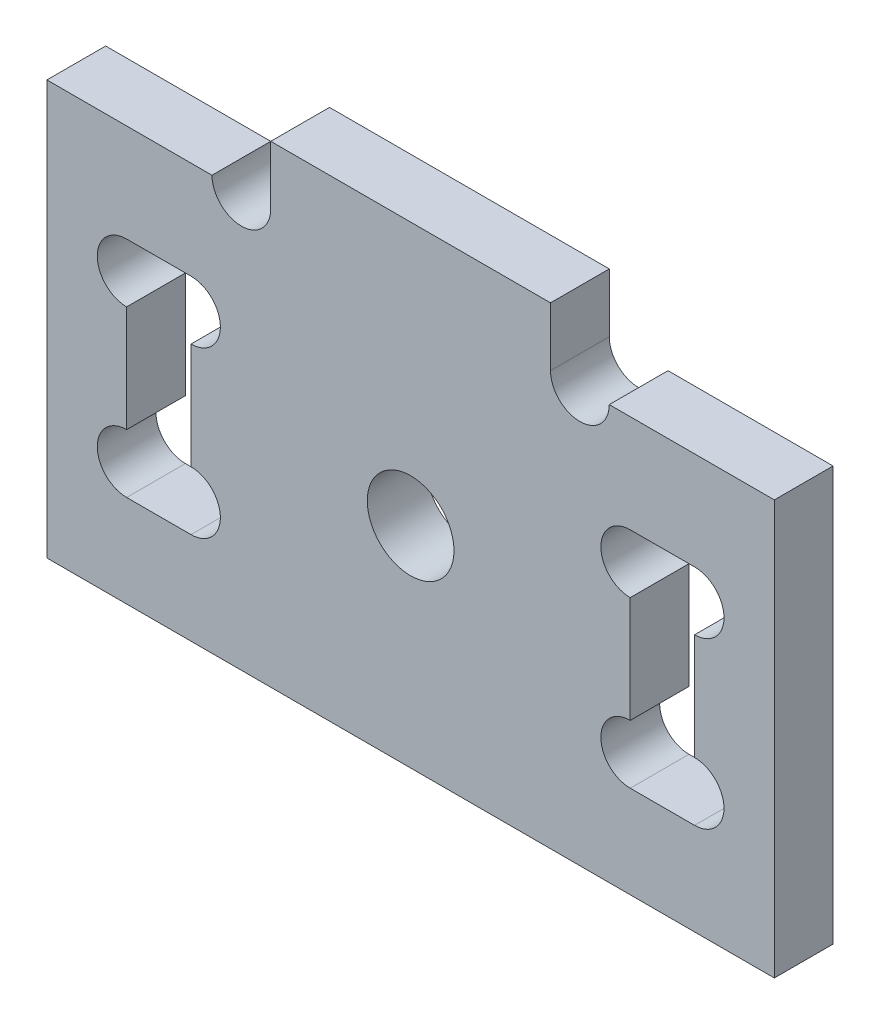
ISO-10303-21;
HEADER;
FILE_DESCRIPTION(('STEP AP214'),'2;1');
FILE_NAME('part.step','',(''),(''),'','','');
FILE_SCHEMA(('AUTOMOTIVE_DESIGN { 1 0 10303 214 1 1 1 1 }'));
ENDSEC;
DATA;
#1=APPLICATION_CONTEXT('core data for automotive mechanical design processes');
#2=APPLICATION_PROTOCOL_DEFINITION('international standard','automotive_design',2000,#1);
#3=PRODUCT_CONTEXT('',#1,'mechanical');
#4=PRODUCT('Part','Part','',(#3));
#5=PRODUCT_RELATED_PRODUCT_CATEGORY('part','',(#4));
#6=PRODUCT_DEFINITION_FORMATION('','',#4);
#7=PRODUCT_DEFINITION_CONTEXT('part definition',#1,'design');
#8=PRODUCT_DEFINITION('design','',#6,#7);
#9=PRODUCT_DEFINITION_SHAPE('','',#8);
#10=(LENGTH_UNIT() NAMED_UNIT(*) SI_UNIT(.MILLI.,.METRE.));
#11=(NAMED_UNIT(*) PLANE_ANGLE_UNIT() SI_UNIT($,.RADIAN.));
#12=(NAMED_UNIT(*) SI_UNIT($,.STERADIAN.) SOLID_ANGLE_UNIT());
#13=UNCERTAINTY_MEASURE_WITH_UNIT(LENGTH_MEASURE(1.E-05),#10,'distance_accuracy_value','');
#14=(GEOMETRIC_REPRESENTATION_CONTEXT(3) GLOBAL_UNCERTAINTY_ASSIGNED_CONTEXT((#13)) GLOBAL_UNIT_ASSIGNED_CONTEXT((#10,
#11,#12)) REPRESENTATION_CONTEXT('',''));
#15=CARTESIAN_POINT('',(0.,0.,0.));
#16=DIRECTION('',(0.,0.,1.));
#17=DIRECTION('',(1.,0.,0.));
#18=AXIS2_PLACEMENT_3D('',#15,#16,#17);
#19=CARTESIAN_POINT('',(7.85,0.,2.1));
#20=DIRECTION('',(-1.,0.,0.));
#21=DIRECTION('',(0.,0.,1.));
#22=AXIS2_PLACEMENT_3D('',#19,#20,#21);
#23=PLANE('',#22);
#24=DIRECTION('',(0.,1.,0.));
#25=VECTOR('',#24,1.);
#26=CARTESIAN_POINT('',(7.85,0.,0.));
#27=LINE('',#26,#25);
#28=CARTESIAN_POINT('',(7.85,-2.,0.));
#29=VERTEX_POINT('',#28);
#30=CARTESIAN_POINT('',(7.85,1.8,0.));
#31=VERTEX_POINT('',#30);
#32=EDGE_CURVE('E298',#29,#31,#27,.T.);
#33=ORIENTED_EDGE('',*,*,#32,.T.);
#34=DIRECTION('',(0.,0.,-1.));
#35=VECTOR('',#34,1.);
#36=CARTESIAN_POINT('',(7.85,1.8,2.1));
#37=LINE('',#36,#35);
#38=CARTESIAN_POINT('',(7.85,1.8,2.1));
#39=VERTEX_POINT('',#38);
#40=EDGE_CURVE('E11',#39,#31,#37,.T.);
#41=ORIENTED_EDGE('',*,*,#40,.F.);
#42=DIRECTION('',(0.,1.,0.));
#43=VECTOR('',#42,1.);
#44=CARTESIAN_POINT('',(7.85,0.,2.1));
#45=LINE('',#44,#43);
#46=CARTESIAN_POINT('',(7.85,-2.,2.1));
#47=VERTEX_POINT('',#46);
#48=EDGE_CURVE('E690',#47,#39,#45,.T.);
#49=ORIENTED_EDGE('',*,*,#48,.F.);
#50=DIRECTION('',(0.,0.,-1.));
#51=VECTOR('',#50,1.);
#52=CARTESIAN_POINT('',(7.85,-2.,2.1));
#53=LINE('',#52,#51);
#54=EDGE_CURVE('E316',#47,#29,#53,.T.);
#55=ORIENTED_EDGE('',*,*,#54,.T.);
#56=EDGE_LOOP('',(#33,#41,#49,#55));
#57=FACE_BOUND('',#56,.T.);
#58=ADVANCED_FACE('F36',(#57),#23,.F.);
#59=CARTESIAN_POINT('',(7.85,2.85,2.1));
#60=DIRECTION('',(0.,0.,-1.));
#61=DIRECTION('',(-1.,0.,0.));
#62=AXIS2_PLACEMENT_3D('',#59,#60,#61);
#63=CYLINDRICAL_SURFACE('',#62,1.05);
#64=CARTESIAN_POINT('',(7.85,2.85,0.));
#65=DIRECTION('',(0.,0.,1.));
#66=DIRECTION('',(1.,0.,0.));
#67=AXIS2_PLACEMENT_3D('',#64,#65,#66);
#68=CIRCLE('',#67,1.05);
#69=CARTESIAN_POINT('',(7.85,3.9,0.));
#70=VERTEX_POINT('',#69);
#71=EDGE_CURVE('E301',#31,#70,#68,.F.);
#72=ORIENTED_EDGE('',*,*,#71,.T.);
#73=DIRECTION('',(0.,0.,-1.));
#74=VECTOR('',#73,1.);
#75=CARTESIAN_POINT('',(7.85,3.9,2.1));
#76=LINE('',#75,#74);
#77=CARTESIAN_POINT('',(7.85,3.9,2.1));
#78=VERTEX_POINT('',#77);
#79=EDGE_CURVE('E46',#78,#70,#76,.T.);
#80=ORIENTED_EDGE('',*,*,#79,.F.);
#81=CARTESIAN_POINT('',(7.85,2.85,2.1));
#82=DIRECTION('',(0.,0.,1.));
#83=DIRECTION('',(1.,0.,0.));
#84=AXIS2_PLACEMENT_3D('',#81,#82,#83);
#85=CIRCLE('',#84,1.05);
#86=EDGE_CURVE('E688',#39,#78,#85,.F.);
#87=ORIENTED_EDGE('',*,*,#86,.F.);
#88=ORIENTED_EDGE('',*,*,#40,.T.);
#89=EDGE_LOOP('',(#72,#80,#87,#88));
#90=FACE_BOUND('',#89,.T.);
#91=ADVANCED_FACE('F422',(#90),#63,.F.);
#92=CARTESIAN_POINT('',(0.,3.9,2.1));
#93=DIRECTION('',(0.,1.,0.));
#94=DIRECTION('',(0.,0.,1.));
#95=AXIS2_PLACEMENT_3D('',#92,#93,#94);
#96=PLANE('',#95);
#97=DIRECTION('',(1.,0.,0.));
#98=VECTOR('',#97,1.);
#99=CARTESIAN_POINT('',(0.,3.9,0.));
#100=LINE('',#99,#98);
#101=CARTESIAN_POINT('',(10.15,3.9,0.));
#102=VERTEX_POINT('',#101);
#103=EDGE_CURVE('E303',#70,#102,#100,.T.);
#104=ORIENTED_EDGE('',*,*,#103,.T.);
#105=DIRECTION('',(0.,0.,-1.));
#106=VECTOR('',#105,1.);
#107=CARTESIAN_POINT('',(10.15,3.9,2.1));
#108=LINE('',#107,#106);
#109=CARTESIAN_POINT('',(10.15,3.9,2.1));
#110=VERTEX_POINT('',#109);
#111=EDGE_CURVE('E323',#110,#102,#108,.T.);
#112=ORIENTED_EDGE('',*,*,#111,.F.);
#113=DIRECTION('',(1.,0.,0.));
#114=VECTOR('',#113,1.);
#115=CARTESIAN_POINT('',(0.,3.9,2.1));
#116=LINE('',#115,#114);
#117=EDGE_CURVE('E684',#78,#110,#116,.T.);
#118=ORIENTED_EDGE('',*,*,#117,.F.);
#119=ORIENTED_EDGE('',*,*,#79,.T.);
#120=EDGE_LOOP('',(#104,#112,#118,#119));
#121=FACE_BOUND('',#120,.T.);
#122=ADVANCED_FACE('F428',(#121),#96,.F.);
#123=CARTESIAN_POINT('',(10.15,2.85,2.1));
#124=DIRECTION('',(0.,0.,-1.));
#125=DIRECTION('',(-1.,0.,0.));
#126=AXIS2_PLACEMENT_3D('',#123,#124,#125);
#127=CYLINDRICAL_SURFACE('',#126,1.05);
#128=CARTESIAN_POINT('',(10.15,2.85,0.));
#129=DIRECTION('',(0.,0.,1.));
#130=DIRECTION('',(1.,0.,0.));
#131=AXIS2_PLACEMENT_3D('',#128,#129,#130);
#132=CIRCLE('',#131,1.05);
#133=CARTESIAN_POINT('',(10.15,1.8,0.));
#134=VERTEX_POINT('',#133);
#135=EDGE_CURVE('E305',#102,#134,#132,.F.);
#136=ORIENTED_EDGE('',*,*,#135,.T.);
#137=DIRECTION('',(0.,0.,-1.));
#138=VECTOR('',#137,1.);
#139=CARTESIAN_POINT('',(10.15,1.8,2.1));
#140=LINE('',#139,#138);
#141=CARTESIAN_POINT('',(10.15,1.8,2.1));
#142=VERTEX_POINT('',#141);
#143=EDGE_CURVE('E321',#142,#134,#140,.T.);
#144=ORIENTED_EDGE('',*,*,#143,.F.);
#145=CARTESIAN_POINT('',(10.15,2.85,2.1));
#146=DIRECTION('',(0.,0.,1.));
#147=DIRECTION('',(1.,0.,0.));
#148=AXIS2_PLACEMENT_3D('',#145,#146,#147);
#149=CIRCLE('',#148,1.05);
#150=EDGE_CURVE('E681',#110,#142,#149,.F.);
#151=ORIENTED_EDGE('',*,*,#150,.F.);
#152=ORIENTED_EDGE('',*,*,#111,.T.);
#153=EDGE_LOOP('',(#136,#144,#151,#152));
#154=FACE_BOUND('',#153,.T.);
#155=ADVANCED_FACE('F631',(#154),#127,.F.);
#156=CARTESIAN_POINT('',(10.15,0.,2.1));
#157=DIRECTION('',(-1.,0.,0.));
#158=DIRECTION('',(0.,0.,1.));
#159=AXIS2_PLACEMENT_3D('',#156,#157,#158);
#160=PLANE('',#159);
#161=DIRECTION('',(0.,1.,0.));
#162=VECTOR('',#161,1.);
#163=CARTESIAN_POINT('',(10.15,0.,0.));
#164=LINE('',#163,#162);
#165=CARTESIAN_POINT('',(10.15,-2.,0.));
#166=VERTEX_POINT('',#165);
#167=EDGE_CURVE('E308',#166,#134,#164,.T.);
#168=ORIENTED_EDGE('',*,*,#167,.F.);
#169=DIRECTION('',(0.,0.,-1.));
#170=VECTOR('',#169,1.);
#171=CARTESIAN_POINT('',(10.15,-2.,2.1));
#172=LINE('',#171,#170);
#173=CARTESIAN_POINT('',(10.15,-2.,2.1));
#174=VERTEX_POINT('',#173);
#175=EDGE_CURVE('E234',#174,#166,#172,.T.);
#176=ORIENTED_EDGE('',*,*,#175,.F.);
#177=DIRECTION('',(0.,1.,0.));
#178=VECTOR('',#177,1.);
#179=CARTESIAN_POINT('',(10.15,0.,2.1));
#180=LINE('',#179,#178);
#181=EDGE_CURVE('E223',#174,#142,#180,.T.);
#182=ORIENTED_EDGE('',*,*,#181,.T.);
#183=ORIENTED_EDGE('',*,*,#143,.T.);
#184=EDGE_LOOP('',(#168,#176,#182,#183));
#185=FACE_BOUND('',#184,.T.);
#186=ADVANCED_FACE('F623',(#185),#160,.T.);
#187=CARTESIAN_POINT('',(10.15,-3.05,2.1));
#188=DIRECTION('',(0.,0.,-1.));
#189=DIRECTION('',(-1.,0.,0.));
#190=AXIS2_PLACEMENT_3D('',#187,#188,#189);
#191=CYLINDRICAL_SURFACE('',#190,1.05);
#192=CARTESIAN_POINT('',(10.15,-3.05,0.));
#193=DIRECTION('',(0.,0.,1.));
#194=DIRECTION('',(1.,0.,0.));
#195=AXIS2_PLACEMENT_3D('',#192,#193,#194);
#196=CIRCLE('',#195,1.05);
#197=CARTESIAN_POINT('',(10.15,-4.1,0.));
#198=VERTEX_POINT('',#197);
#199=EDGE_CURVE('E230',#166,#198,#196,.F.);
#200=ORIENTED_EDGE('',*,*,#199,.T.);
#201=DIRECTION('',(0.,0.,-1.));
#202=VECTOR('',#201,1.);
#203=CARTESIAN_POINT('',(10.15,-4.1,2.1));
#204=LINE('',#203,#202);
#205=CARTESIAN_POINT('',(10.15,-4.1,2.1));
#206=VERTEX_POINT('',#205);
#207=EDGE_CURVE('E227',#206,#198,#204,.T.);
#208=ORIENTED_EDGE('',*,*,#207,.F.);
#209=CARTESIAN_POINT('',(10.15,-3.05,2.1));
#210=DIRECTION('',(0.,0.,1.));
#211=DIRECTION('',(1.,0.,0.));
#212=AXIS2_PLACEMENT_3D('',#209,#210,#211);
#213=CIRCLE('',#212,1.05);
#214=EDGE_CURVE('E217',#174,#206,#213,.F.);
#215=ORIENTED_EDGE('',*,*,#214,.F.);
#216=ORIENTED_EDGE('',*,*,#175,.T.);
#217=EDGE_LOOP('',(#200,#208,#215,#216));
#218=FACE_BOUND('',#217,.T.);
#219=ADVANCED_FACE('F228',(#218),#191,.F.);
#220=CARTESIAN_POINT('',(0.,-4.1,2.1));
#221=DIRECTION('',(0.,1.,0.));
#222=DIRECTION('',(0.,0.,1.));
#223=AXIS2_PLACEMENT_3D('',#220,#221,#222);
#224=PLANE('',#223);
#225=DIRECTION('',(1.,0.,0.));
#226=VECTOR('',#225,1.);
#227=CARTESIAN_POINT('',(0.,-4.1,0.));
#228=LINE('',#227,#226);
#229=CARTESIAN_POINT('',(7.85,-4.1,0.));
#230=VERTEX_POINT('',#229);
#231=EDGE_CURVE('E312',#230,#198,#228,.T.);
#232=ORIENTED_EDGE('',*,*,#231,.F.);
#233=DIRECTION('',(0.,0.,-1.));
#234=VECTOR('',#233,1.);
#235=CARTESIAN_POINT('',(7.85,-4.1,2.1));
#236=LINE('',#235,#234);
#237=CARTESIAN_POINT('',(7.85,-4.1,2.1));
#238=VERTEX_POINT('',#237);
#239=EDGE_CURVE('E137',#238,#230,#236,.T.);
#240=ORIENTED_EDGE('',*,*,#239,.F.);
#241=DIRECTION('',(1.,0.,0.));
#242=VECTOR('',#241,1.);
#243=CARTESIAN_POINT('',(0.,-4.1,2.1));
#244=LINE('',#243,#242);
#245=EDGE_CURVE('E221',#238,#206,#244,.T.);
#246=ORIENTED_EDGE('',*,*,#245,.T.);
#247=ORIENTED_EDGE('',*,*,#207,.T.);
#248=EDGE_LOOP('',(#232,#240,#246,#247));
#249=FACE_BOUND('',#248,.T.);
#250=ADVANCED_FACE('F236',(#249),#224,.T.);
#251=CARTESIAN_POINT('',(-7.85,-3.05,2.1));
#252=DIRECTION('',(0.,0.,-1.));
#253=DIRECTION('',(-1.,0.,0.));
#254=AXIS2_PLACEMENT_3D('',#251,#252,#253);
#255=CYLINDRICAL_SURFACE('',#254,1.05);
#256=CARTESIAN_POINT('',(-7.85,-3.05,0.));
#257=DIRECTION('',(0.,0.,1.));
#258=DIRECTION('',(1.,0.,0.));
#259=AXIS2_PLACEMENT_3D('',#256,#257,#258);
#260=CIRCLE('',#259,1.05);
#261=CARTESIAN_POINT('',(-7.85,-4.1,0.));
#262=VERTEX_POINT('',#261);
#263=CARTESIAN_POINT('',(-7.85,-2.,0.));
#264=VERTEX_POINT('',#263);
#265=EDGE_CURVE('E271',#262,#264,#260,.T.);
#266=ORIENTED_EDGE('',*,*,#265,.F.);
#267=DIRECTION('',(0.,0.,-1.));
#268=VECTOR('',#267,1.);
#269=CARTESIAN_POINT('',(-7.85,-4.1,2.1));
#270=LINE('',#269,#268);
#271=CARTESIAN_POINT('',(-7.85,-4.1,2.1));
#272=VERTEX_POINT('',#271);
#273=EDGE_CURVE('E318',#272,#262,#270,.T.);
#274=ORIENTED_EDGE('',*,*,#273,.F.);
#275=CARTESIAN_POINT('',(-7.85,-3.05,2.1));
#276=DIRECTION('',(0.,0.,1.));
#277=DIRECTION('',(1.,0.,0.));
#278=AXIS2_PLACEMENT_3D('',#275,#276,#277);
#279=CIRCLE('',#278,1.05);
#280=CARTESIAN_POINT('',(-7.85,-2.,2.1));
#281=VERTEX_POINT('',#280);
#282=EDGE_CURVE('E714',#272,#281,#279,.T.);
#283=ORIENTED_EDGE('',*,*,#282,.T.);
#284=DIRECTION('',(0.,0.,-1.));
#285=VECTOR('',#284,1.);
#286=CARTESIAN_POINT('',(-7.85,-2.,2.1));
#287=LINE('',#286,#285);
#288=EDGE_CURVE('E328',#281,#264,#287,.T.);
#289=ORIENTED_EDGE('',*,*,#288,.T.);
#290=EDGE_LOOP('',(#266,#274,#283,#289));
#291=FACE_BOUND('',#290,.T.);
#292=ADVANCED_FACE('F464',(#291),#255,.F.);
#293=CARTESIAN_POINT('',(0.,-4.1,2.1));
#294=DIRECTION('',(0.,-1.,0.));
#295=DIRECTION('',(0.,0.,-1.));
#296=AXIS2_PLACEMENT_3D('',#293,#294,#295);
#297=PLANE('',#296);
#298=DIRECTION('',(-1.,0.,0.));
#299=VECTOR('',#298,1.);
#300=CARTESIAN_POINT('',(0.,-4.1,0.));
#301=LINE('',#300,#299);
#302=CARTESIAN_POINT('',(-10.15,-4.1,0.));
#303=VERTEX_POINT('',#302);
#304=EDGE_CURVE('E274',#262,#303,#301,.T.);
#305=ORIENTED_EDGE('',*,*,#304,.T.);
#306=DIRECTION('',(0.,0.,-1.));
#307=VECTOR('',#306,1.);
#308=CARTESIAN_POINT('',(-10.15,-4.1,2.1));
#309=LINE('',#308,#307);
#310=CARTESIAN_POINT('',(-10.15,-4.1,2.1));
#311=VERTEX_POINT('',#310);
#312=EDGE_CURVE('E340',#311,#303,#309,.T.);
#313=ORIENTED_EDGE('',*,*,#312,.F.);
#314=DIRECTION('',(-1.,0.,0.));
#315=VECTOR('',#314,1.);
#316=CARTESIAN_POINT('',(0.,-4.1,2.1));
#317=LINE('',#316,#315);
#318=EDGE_CURVE('E712',#272,#311,#317,.T.);
#319=ORIENTED_EDGE('',*,*,#318,.F.);
#320=ORIENTED_EDGE('',*,*,#273,.T.);
#321=EDGE_LOOP('',(#305,#313,#319,#320));
#322=FACE_BOUND('',#321,.T.);
#323=ADVANCED_FACE('F460',(#322),#297,.F.);
#324=CARTESIAN_POINT('',(-10.15,-3.05,2.1));
#325=DIRECTION('',(0.,0.,-1.));
#326=DIRECTION('',(-1.,0.,0.));
#327=AXIS2_PLACEMENT_3D('',#324,#325,#326);
#328=CYLINDRICAL_SURFACE('',#327,1.05);
#329=CARTESIAN_POINT('',(-10.15,-3.05,0.));
#330=DIRECTION('',(0.,0.,1.));
#331=DIRECTION('',(1.,0.,0.));
#332=AXIS2_PLACEMENT_3D('',#329,#330,#331);
#333=CIRCLE('',#332,1.05);
#334=CARTESIAN_POINT('',(-10.15,-2.,0.));
#335=VERTEX_POINT('',#334);
#336=EDGE_CURVE('E277',#335,#303,#333,.T.);
#337=ORIENTED_EDGE('',*,*,#336,.F.);
#338=DIRECTION('',(0.,0.,-1.));
#339=VECTOR('',#338,1.);
#340=CARTESIAN_POINT('',(-10.15,-2.,2.1));
#341=LINE('',#340,#339);
#342=CARTESIAN_POINT('',(-10.15,-2.,2.1));
#343=VERTEX_POINT('',#342);
#344=EDGE_CURVE('E338',#343,#335,#341,.T.);
#345=ORIENTED_EDGE('',*,*,#344,.F.);
#346=CARTESIAN_POINT('',(-10.15,-3.05,2.1));
#347=DIRECTION('',(0.,0.,1.));
#348=DIRECTION('',(1.,0.,0.));
#349=AXIS2_PLACEMENT_3D('',#346,#347,#348);
#350=CIRCLE('',#349,1.05);
#351=EDGE_CURVE('E709',#343,#311,#350,.T.);
#352=ORIENTED_EDGE('',*,*,#351,.T.);
#353=ORIENTED_EDGE('',*,*,#312,.T.);
#354=EDGE_LOOP('',(#337,#345,#352,#353));
#355=FACE_BOUND('',#354,.T.);
#356=ADVANCED_FACE('F456',(#355),#328,.F.);
#357=CARTESIAN_POINT('',(-10.15,0.,2.1));
#358=DIRECTION('',(-1.,0.,0.));
#359=DIRECTION('',(0.,0.,1.));
#360=AXIS2_PLACEMENT_3D('',#357,#358,#359);
#361=PLANE('',#360);
#362=DIRECTION('',(0.,1.,0.));
#363=VECTOR('',#362,1.);
#364=CARTESIAN_POINT('',(-10.15,0.,0.));
#365=LINE('',#364,#363);
#366=CARTESIAN_POINT('',(-10.15,1.8,0.));
#367=VERTEX_POINT('',#366);
#368=EDGE_CURVE('E280',#335,#367,#365,.T.);
#369=ORIENTED_EDGE('',*,*,#368,.T.);
#370=DIRECTION('',(0.,0.,-1.));
#371=VECTOR('',#370,1.);
#372=CARTESIAN_POINT('',(-10.15,1.8,2.1));
#373=LINE('',#372,#371);
#374=CARTESIAN_POINT('',(-10.15,1.8,2.1));
#375=VERTEX_POINT('',#374);
#376=EDGE_CURVE('E336',#375,#367,#373,.T.);
#377=ORIENTED_EDGE('',*,*,#376,.F.);
#378=DIRECTION('',(0.,1.,0.));
#379=VECTOR('',#378,1.);
#380=CARTESIAN_POINT('',(-10.15,0.,2.1));
#381=LINE('',#380,#379);
#382=EDGE_CURVE('E707',#343,#375,#381,.T.);
#383=ORIENTED_EDGE('',*,*,#382,.F.);
#384=ORIENTED_EDGE('',*,*,#344,.T.);
#385=EDGE_LOOP('',(#369,#377,#383,#384));
#386=FACE_BOUND('',#385,.T.);
#387=ADVANCED_FACE('F452',(#386),#361,.F.);
#388=CARTESIAN_POINT('',(-10.15,2.85,2.1));
#389=DIRECTION('',(0.,0.,-1.));
#390=DIRECTION('',(-1.,0.,0.));
#391=AXIS2_PLACEMENT_3D('',#388,#389,#390);
#392=CYLINDRICAL_SURFACE('',#391,1.05);
#393=CARTESIAN_POINT('',(-10.15,2.85,0.));
#394=DIRECTION('',(0.,0.,1.));
#395=DIRECTION('',(1.,0.,0.));
#396=AXIS2_PLACEMENT_3D('',#393,#394,#395);
#397=CIRCLE('',#396,1.05);
#398=CARTESIAN_POINT('',(-10.15,3.9,0.));
#399=VERTEX_POINT('',#398);
#400=EDGE_CURVE('E283',#399,#367,#397,.T.);
#401=ORIENTED_EDGE('',*,*,#400,.F.);
#402=DIRECTION('',(0.,0.,-1.));
#403=VECTOR('',#402,1.);
#404=CARTESIAN_POINT('',(-10.15,3.9,2.1));
#405=LINE('',#404,#403);
#406=CARTESIAN_POINT('',(-10.15,3.9,2.1));
#407=VERTEX_POINT('',#406);
#408=EDGE_CURVE('E334',#407,#399,#405,.T.);
#409=ORIENTED_EDGE('',*,*,#408,.F.);
#410=CARTESIAN_POINT('',(-10.15,2.85,2.1));
#411=DIRECTION('',(0.,0.,1.));
#412=DIRECTION('',(1.,0.,0.));
#413=AXIS2_PLACEMENT_3D('',#410,#411,#412);
#414=CIRCLE('',#413,1.05);
#415=EDGE_CURVE('E704',#407,#375,#414,.T.);
#416=ORIENTED_EDGE('',*,*,#415,.T.);
#417=ORIENTED_EDGE('',*,*,#376,.T.);
#418=EDGE_LOOP('',(#401,#409,#416,#417));
#419=FACE_BOUND('',#418,.T.);
#420=ADVANCED_FACE('F448',(#419),#392,.F.);
#421=CARTESIAN_POINT('',(0.,3.9,2.1));
#422=DIRECTION('',(0.,-1.,0.));
#423=DIRECTION('',(0.,0.,-1.));
#424=AXIS2_PLACEMENT_3D('',#421,#422,#423);
#425=PLANE('',#424);
#426=DIRECTION('',(-1.,0.,0.));
#427=VECTOR('',#426,1.);
#428=CARTESIAN_POINT('',(0.,3.9,0.));
#429=LINE('',#428,#427);
#430=CARTESIAN_POINT('',(-7.85,3.9,0.));
#431=VERTEX_POINT('',#430);
#432=EDGE_CURVE('E286',#431,#399,#429,.T.);
#433=ORIENTED_EDGE('',*,*,#432,.F.);
#434=DIRECTION('',(0.,0.,-1.));
#435=VECTOR('',#434,1.);
#436=CARTESIAN_POINT('',(-7.85,3.9,2.1));
#437=LINE('',#436,#435);
#438=CARTESIAN_POINT('',(-7.85,3.9,2.1));
#439=VERTEX_POINT('',#438);
#440=EDGE_CURVE('E332',#439,#431,#437,.T.);
#441=ORIENTED_EDGE('',*,*,#440,.F.);
#442=DIRECTION('',(-1.,0.,0.));
#443=VECTOR('',#442,1.);
#444=CARTESIAN_POINT('',(0.,3.9,2.1));
#445=LINE('',#444,#443);
#446=EDGE_CURVE('E701',#439,#407,#445,.T.);
#447=ORIENTED_EDGE('',*,*,#446,.T.);
#448=ORIENTED_EDGE('',*,*,#408,.T.);
#449=EDGE_LOOP('',(#433,#441,#447,#448));
#450=FACE_BOUND('',#449,.T.);
#451=ADVANCED_FACE('F444',(#450),#425,.T.);
#452=CARTESIAN_POINT('',(-7.85,2.85,2.1));
#453=DIRECTION('',(0.,0.,-1.));
#454=DIRECTION('',(-1.,0.,0.));
#455=AXIS2_PLACEMENT_3D('',#452,#453,#454);
#456=CYLINDRICAL_SURFACE('',#455,1.05);
#457=CARTESIAN_POINT('',(-7.85,2.85,0.));
#458=DIRECTION('',(0.,0.,1.));
#459=DIRECTION('',(1.,0.,0.));
#460=AXIS2_PLACEMENT_3D('',#457,#458,#459);
#461=CIRCLE('',#460,1.05);
#462=CARTESIAN_POINT('',(-7.85,1.8,0.));
#463=VERTEX_POINT('',#462);
#464=EDGE_CURVE('E289',#463,#431,#461,.T.);
#465=ORIENTED_EDGE('',*,*,#464,.F.);
#466=DIRECTION('',(0.,0.,-1.));
#467=VECTOR('',#466,1.);
#468=CARTESIAN_POINT('',(-7.85,1.8,2.1));
#469=LINE('',#468,#467);
#470=CARTESIAN_POINT('',(-7.85,1.8,2.1));
#471=VERTEX_POINT('',#470);
#472=EDGE_CURVE('E330',#471,#463,#469,.T.);
#473=ORIENTED_EDGE('',*,*,#472,.F.);
#474=CARTESIAN_POINT('',(-7.85,2.85,2.1));
#475=DIRECTION('',(0.,0.,1.));
#476=DIRECTION('',(1.,0.,0.));
#477=AXIS2_PLACEMENT_3D('',#474,#475,#476);
#478=CIRCLE('',#477,1.05);
#479=EDGE_CURVE('E698',#471,#439,#478,.T.);
#480=ORIENTED_EDGE('',*,*,#479,.T.);
#481=ORIENTED_EDGE('',*,*,#440,.T.);
#482=EDGE_LOOP('',(#465,#473,#480,#481));
#483=FACE_BOUND('',#482,.T.);
#484=ADVANCED_FACE('F441',(#483),#456,.F.);
#485=CARTESIAN_POINT('',(-6.05,7.4,2.1));
#486=DIRECTION('',(0.,0.,-1.));
#487=DIRECTION('',(-1.,0.,0.));
#488=AXIS2_PLACEMENT_3D('',#485,#486,#487);
#489=CYLINDRICAL_SURFACE('',#488,1.05);
#490=CARTESIAN_POINT('',(-6.05,7.4,0.));
#491=DIRECTION('',(0.,0.,1.));
#492=DIRECTION('',(1.,0.,0.));
#493=AXIS2_PLACEMENT_3D('',#490,#491,#492);
#494=CIRCLE('',#493,1.05);
#495=CARTESIAN_POINT('',(-7.1,7.4,0.));
#496=VERTEX_POINT('',#495);
#497=CARTESIAN_POINT('',(-5.,7.4,0.));
#498=VERTEX_POINT('',#497);
#499=EDGE_CURVE('E242',#496,#498,#494,.T.);
#500=ORIENTED_EDGE('',*,*,#499,.F.);
#501=DIRECTION('',(0.,0.,-1.));
#502=VECTOR('',#501,1.);
#503=CARTESIAN_POINT('',(-7.1,7.4,2.1));
#504=LINE('',#503,#502);
#505=CARTESIAN_POINT('',(-7.1,7.4,2.1));
#506=VERTEX_POINT('',#505);
#507=EDGE_CURVE('E40',#506,#496,#504,.T.);
#508=ORIENTED_EDGE('',*,*,#507,.F.);
#509=CARTESIAN_POINT('',(-6.05,7.4,2.1));
#510=DIRECTION('',(0.,0.,1.));
#511=DIRECTION('',(1.,0.,0.));
#512=AXIS2_PLACEMENT_3D('',#509,#510,#511);
#513=CIRCLE('',#512,1.05);
#514=CARTESIAN_POINT('',(-5.,7.4,2.1));
#515=VERTEX_POINT('',#514);
#516=EDGE_CURVE('E315',#506,#515,#513,.T.);
#517=ORIENTED_EDGE('',*,*,#516,.T.);
#518=DIRECTION('',(0.,0.,-1.));
#519=VECTOR('',#518,1.);
#520=CARTESIAN_POINT('',(-5.,7.4,2.1));
#521=LINE('',#520,#519);
#522=EDGE_CURVE('E238',#515,#498,#521,.T.);
#523=ORIENTED_EDGE('',*,*,#522,.T.);
#524=EDGE_LOOP('',(#500,#508,#517,#523));
#525=FACE_BOUND('',#524,.T.);
#526=ADVANCED_FACE('F38',(#525),#489,.F.);
#527=CARTESIAN_POINT('',(0.,7.4,2.1));
#528=DIRECTION('',(0.,-1.,0.));
#529=DIRECTION('',(1.,0.,0.));
#530=AXIS2_PLACEMENT_3D('',#527,#528,#529);
#531=PLANE('',#530);
#532=DIRECTION('',(-1.,0.,0.));
#533=VECTOR('',#532,1.);
#534=CARTESIAN_POINT('',(0.,7.4,0.));
#535=LINE('',#534,#533);
#536=CARTESIAN_POINT('',(-13.,7.4,0.));
#537=VERTEX_POINT('',#536);
#538=EDGE_CURVE('E245',#496,#537,#535,.T.);
#539=ORIENTED_EDGE('',*,*,#538,.T.);
#540=DIRECTION('',(0.,0.,-1.));
#541=VECTOR('',#540,1.);
#542=CARTESIAN_POINT('',(-13.,7.4,2.1));
#543=LINE('',#542,#541);
#544=CARTESIAN_POINT('',(-13.,7.4,2.1));
#545=VERTEX_POINT('',#544);
#546=EDGE_CURVE('E358',#545,#537,#543,.T.);
#547=ORIENTED_EDGE('',*,*,#546,.F.);
#548=DIRECTION('',(-1.,0.,0.));
#549=VECTOR('',#548,1.);
#550=CARTESIAN_POINT('',(0.,7.4,2.1));
#551=LINE('',#550,#549);
#552=EDGE_CURVE('E366',#506,#545,#551,.T.);
#553=ORIENTED_EDGE('',*,*,#552,.F.);
#554=ORIENTED_EDGE('',*,*,#507,.T.);
#555=EDGE_LOOP('',(#539,#547,#553,#554));
#556=FACE_BOUND('',#555,.T.);
#557=ADVANCED_FACE('F365',(#556),#531,.F.);
#558=CARTESIAN_POINT('',(-13.,0.,2.1));
#559=DIRECTION('',(-1.,0.,0.));
#560=DIRECTION('',(0.,0.,1.));
#561=AXIS2_PLACEMENT_3D('',#558,#559,#560);
#562=PLANE('',#561);
#563=DIRECTION('',(0.,1.,0.));
#564=VECTOR('',#563,1.);
#565=CARTESIAN_POINT('',(-13.,0.,0.));
#566=LINE('',#565,#564);
#567=CARTESIAN_POINT('',(-13.,-7.4,0.));
#568=VERTEX_POINT('',#567);
#569=EDGE_CURVE('E248',#568,#537,#566,.T.);
#570=ORIENTED_EDGE('',*,*,#569,.F.);
#571=DIRECTION('',(0.,0.,-1.));
#572=VECTOR('',#571,1.);
#573=CARTESIAN_POINT('',(-13.,-7.4,2.1));
#574=LINE('',#573,#572);
#575=CARTESIAN_POINT('',(-13.,-7.4,2.1));
#576=VERTEX_POINT('',#575);
#577=EDGE_CURVE('E357',#576,#568,#574,.T.);
#578=ORIENTED_EDGE('',*,*,#577,.F.);
#579=DIRECTION('',(0.,1.,0.));
#580=VECTOR('',#579,1.);
#581=CARTESIAN_POINT('',(-13.,0.,2.1));
#582=LINE('',#581,#580);
#583=EDGE_CURVE('E725',#576,#545,#582,.T.);
#584=ORIENTED_EDGE('',*,*,#583,.T.);
#585=ORIENTED_EDGE('',*,*,#546,.T.);
#586=EDGE_LOOP('',(#570,#578,#584,#585));
#587=FACE_BOUND('',#586,.T.);
#588=ADVANCED_FACE('F413',(#587),#562,.T.);
#589=CARTESIAN_POINT('',(0.,-7.4,2.1));
#590=DIRECTION('',(0.,-1.,0.));
#591=DIRECTION('',(1.,0.,0.));
#592=AXIS2_PLACEMENT_3D('',#589,#590,#591);
#593=PLANE('',#592);
#594=DIRECTION('',(-1.,0.,0.));
#595=VECTOR('',#594,1.);
#596=CARTESIAN_POINT('',(0.,-7.4,0.));
#597=LINE('',#596,#595);
#598=CARTESIAN_POINT('',(13.,-7.4,0.));
#599=VERTEX_POINT('',#598);
#600=EDGE_CURVE('E251',#599,#568,#597,.T.);
#601=ORIENTED_EDGE('',*,*,#600,.F.);
#602=DIRECTION('',(0.,0.,-1.));
#603=VECTOR('',#602,1.);
#604=CARTESIAN_POINT('',(13.,-7.4,2.1));
#605=LINE('',#604,#603);
#606=CARTESIAN_POINT('',(13.,-7.4,2.1));
#607=VERTEX_POINT('',#606);
#608=EDGE_CURVE('E355',#607,#599,#605,.T.);
#609=ORIENTED_EDGE('',*,*,#608,.F.);
#610=DIRECTION('',(-1.,0.,0.));
#611=VECTOR('',#610,1.);
#612=CARTESIAN_POINT('',(0.,-7.4,2.1));
#613=LINE('',#612,#611);
#614=EDGE_CURVE('E411',#607,#576,#613,.T.);
#615=ORIENTED_EDGE('',*,*,#614,.T.);
#616=ORIENTED_EDGE('',*,*,#577,.T.);
#617=EDGE_LOOP('',(#601,#609,#615,#616));
#618=FACE_BOUND('',#617,.T.);
#619=ADVANCED_FACE('F410',(#618),#593,.T.);
#620=CARTESIAN_POINT('',(13.,0.,2.1));
#621=DIRECTION('',(-1.,0.,0.));
#622=DIRECTION('',(0.,0.,1.));
#623=AXIS2_PLACEMENT_3D('',#620,#621,#622);
#624=PLANE('',#623);
#625=DIRECTION('',(0.,1.,0.));
#626=VECTOR('',#625,1.);
#627=CARTESIAN_POINT('',(13.,0.,0.));
#628=LINE('',#627,#626);
#629=CARTESIAN_POINT('',(13.,7.4,0.));
#630=VERTEX_POINT('',#629);
#631=EDGE_CURVE('E254',#599,#630,#628,.T.);
#632=ORIENTED_EDGE('',*,*,#631,.T.);
#633=DIRECTION('',(0.,0.,-1.));
#634=VECTOR('',#633,1.);
#635=CARTESIAN_POINT('',(13.,7.4,2.1));
#636=LINE('',#635,#634);
#637=CARTESIAN_POINT('',(13.,7.4,2.1));
#638=VERTEX_POINT('',#637);
#639=EDGE_CURVE('E352',#638,#630,#636,.T.);
#640=ORIENTED_EDGE('',*,*,#639,.F.);
#641=DIRECTION('',(0.,1.,0.));
#642=VECTOR('',#641,1.);
#643=CARTESIAN_POINT('',(13.,0.,2.1));
#644=LINE('',#643,#642);
#645=EDGE_CURVE('E406',#607,#638,#644,.T.);
#646=ORIENTED_EDGE('',*,*,#645,.F.);
#647=ORIENTED_EDGE('',*,*,#608,.T.);
#648=EDGE_LOOP('',(#632,#640,#646,#647));
#649=FACE_BOUND('',#648,.T.);
#650=ADVANCED_FACE('F405',(#649),#624,.F.);
#651=CARTESIAN_POINT('',(0.,7.4,2.1));
#652=DIRECTION('',(0.,-1.,0.));
#653=DIRECTION('',(1.,0.,0.));
#654=AXIS2_PLACEMENT_3D('',#651,#652,#653);
#655=PLANE('',#654);
#656=DIRECTION('',(-1.,0.,0.));
#657=VECTOR('',#656,1.);
#658=CARTESIAN_POINT('',(0.,7.4,0.));
#659=LINE('',#658,#657);
#660=CARTESIAN_POINT('',(7.1,7.4,0.));
#661=VERTEX_POINT('',#660);
#662=EDGE_CURVE('E256',#630,#661,#659,.T.);
#663=ORIENTED_EDGE('',*,*,#662,.T.);
#664=DIRECTION('',(0.,0.,-1.));
#665=VECTOR('',#664,1.);
#666=CARTESIAN_POINT('',(7.1,7.4,2.1));
#667=LINE('',#666,#665);
#668=CARTESIAN_POINT('',(7.1,7.4,2.1));
#669=VERTEX_POINT('',#668);
#670=EDGE_CURVE('E350',#669,#661,#667,.T.);
#671=ORIENTED_EDGE('',*,*,#670,.F.);
#672=DIRECTION('',(-1.,0.,0.));
#673=VECTOR('',#672,1.);
#674=CARTESIAN_POINT('',(0.,7.4,2.1));
#675=LINE('',#674,#673);
#676=EDGE_CURVE('E402',#638,#669,#675,.T.);
#677=ORIENTED_EDGE('',*,*,#676,.F.);
#678=ORIENTED_EDGE('',*,*,#639,.T.);
#679=EDGE_LOOP('',(#663,#671,#677,#678));
#680=FACE_BOUND('',#679,.T.);
#681=ADVANCED_FACE('F399',(#680),#655,.F.);
#682=CARTESIAN_POINT('',(6.05,7.4,2.1));
#683=DIRECTION('',(0.,0.,-1.));
#684=DIRECTION('',(-1.,0.,0.));
#685=AXIS2_PLACEMENT_3D('',#682,#683,#684);
#686=CYLINDRICAL_SURFACE('',#685,1.05);
#687=CARTESIAN_POINT('',(6.05,7.4,0.));
#688=DIRECTION('',(0.,0.,1.));
#689=DIRECTION('',(1.,0.,0.));
#690=AXIS2_PLACEMENT_3D('',#687,#688,#689);
#691=CIRCLE('',#690,1.05);
#692=CARTESIAN_POINT('',(5.,7.4,0.));
#693=VERTEX_POINT('',#692);
#694=EDGE_CURVE('E259',#693,#661,#691,.T.);
#695=ORIENTED_EDGE('',*,*,#694,.F.);
#696=DIRECTION('',(0.,0.,-1.));
#697=VECTOR('',#696,1.);
#698=CARTESIAN_POINT('',(5.,7.4,2.1));
#699=LINE('',#698,#697);
#700=CARTESIAN_POINT('',(5.,7.4,2.1));
#701=VERTEX_POINT('',#700);
#702=EDGE_CURVE('E348',#701,#693,#699,.T.);
#703=ORIENTED_EDGE('',*,*,#702,.F.);
#704=CARTESIAN_POINT('',(6.05,7.4,2.1));
#705=DIRECTION('',(0.,0.,1.));
#706=DIRECTION('',(1.,0.,0.));
#707=AXIS2_PLACEMENT_3D('',#704,#705,#706);
#708=CIRCLE('',#707,1.05);
#709=EDGE_CURVE('E720',#701,#669,#708,.T.);
#710=ORIENTED_EDGE('',*,*,#709,.T.);
#711=ORIENTED_EDGE('',*,*,#670,.T.);
#712=EDGE_LOOP('',(#695,#703,#710,#711));
#713=FACE_BOUND('',#712,.T.);
#714=ADVANCED_FACE('F393',(#713),#686,.F.);
#715=CARTESIAN_POINT('',(5.,0.,2.1));
#716=DIRECTION('',(1.,0.,0.));
#717=DIRECTION('',(0.,0.,-1.));
#718=AXIS2_PLACEMENT_3D('',#715,#716,#717);
#719=PLANE('',#718);
#720=DIRECTION('',(0.,-1.,0.));
#721=VECTOR('',#720,1.);
#722=CARTESIAN_POINT('',(5.,0.,0.));
#723=LINE('',#722,#721);
#724=CARTESIAN_POINT('',(5.,9.5,0.));
#725=VERTEX_POINT('',#724);
#726=EDGE_CURVE('E262',#725,#693,#723,.T.);
#727=ORIENTED_EDGE('',*,*,#726,.F.);
#728=DIRECTION('',(0.,0.,-1.));
#729=VECTOR('',#728,1.);
#730=CARTESIAN_POINT('',(5.,9.5,2.1));
#731=LINE('',#730,#729);
#732=CARTESIAN_POINT('',(5.,9.5,2.1));
#733=VERTEX_POINT('',#732);
#734=EDGE_CURVE('E346',#733,#725,#731,.T.);
#735=ORIENTED_EDGE('',*,*,#734,.F.);
#736=DIRECTION('',(0.,-1.,0.));
#737=VECTOR('',#736,1.);
#738=CARTESIAN_POINT('',(5.,0.,2.1));
#739=LINE('',#738,#737);
#740=EDGE_CURVE('E389',#733,#701,#739,.T.);
#741=ORIENTED_EDGE('',*,*,#740,.T.);
#742=ORIENTED_EDGE('',*,*,#702,.T.);
#743=EDGE_LOOP('',(#727,#735,#741,#742));
#744=FACE_BOUND('',#743,.T.);
#745=ADVANCED_FACE('F387',(#744),#719,.T.);
#746=CARTESIAN_POINT('',(0.,9.5,2.1));
#747=DIRECTION('',(0.,1.,0.));
#748=DIRECTION('',(0.,0.,1.));
#749=AXIS2_PLACEMENT_3D('',#746,#747,#748);
#750=PLANE('',#749);
#751=DIRECTION('',(1.,0.,0.));
#752=VECTOR('',#751,1.);
#753=CARTESIAN_POINT('',(0.,9.5,0.));
#754=LINE('',#753,#752);
#755=CARTESIAN_POINT('',(-5.,9.5,0.));
#756=VERTEX_POINT('',#755);
#757=EDGE_CURVE('E265',#756,#725,#754,.T.);
#758=ORIENTED_EDGE('',*,*,#757,.F.);
#759=DIRECTION('',(0.,0.,-1.));
#760=VECTOR('',#759,1.);
#761=CARTESIAN_POINT('',(-5.,9.5,2.1));
#762=LINE('',#761,#760);
#763=CARTESIAN_POINT('',(-5.,9.5,2.1));
#764=VERTEX_POINT('',#763);
#765=EDGE_CURVE('E344',#764,#756,#762,.T.);
#766=ORIENTED_EDGE('',*,*,#765,.F.);
#767=DIRECTION('',(1.,0.,0.));
#768=VECTOR('',#767,1.);
#769=CARTESIAN_POINT('',(0.,9.5,2.1));
#770=LINE('',#769,#768);
#771=EDGE_CURVE('E383',#764,#733,#770,.T.);
#772=ORIENTED_EDGE('',*,*,#771,.T.);
#773=ORIENTED_EDGE('',*,*,#734,.T.);
#774=EDGE_LOOP('',(#758,#766,#772,#773));
#775=FACE_BOUND('',#774,.T.);
#776=ADVANCED_FACE('F380',(#775),#750,.T.);
#777=CARTESIAN_POINT('',(0.,0.1,2.1));
#778=DIRECTION('',(0.,0.,-1.));
#779=DIRECTION('',(-1.,0.,0.));
#780=AXIS2_PLACEMENT_3D('',#777,#778,#779);
#781=CYLINDRICAL_SURFACE('',#780,1.55);
#782=CARTESIAN_POINT('',(0.,0.1,2.1));
#783=DIRECTION('',(0.,0.,1.));
#784=DIRECTION('',(1.,0.,0.));
#785=AXIS2_PLACEMENT_3D('',#782,#783,#784);
#786=CIRCLE('',#785,1.55);
#787=CARTESIAN_POINT('',(1.55,0.1,2.1));
#788=VERTEX_POINT('',#787);
#789=EDGE_CURVE('E692',#788,#788,#786,.T.);
#790=ORIENTED_EDGE('',*,*,#789,.T.);
#791=EDGE_LOOP('',(#790));
#792=FACE_BOUND('',#791,.T.);
#793=CARTESIAN_POINT('',(0.,0.1,0.));
#794=DIRECTION('',(0.,0.,1.));
#795=DIRECTION('',(1.,0.,0.));
#796=AXIS2_PLACEMENT_3D('',#793,#794,#795);
#797=CIRCLE('',#796,1.55);
#798=CARTESIAN_POINT('',(1.55,0.1,0.));
#799=VERTEX_POINT('',#798);
#800=EDGE_CURVE('E295',#799,#799,#797,.T.);
#801=ORIENTED_EDGE('',*,*,#800,.F.);
#802=EDGE_LOOP('',(#801));
#803=FACE_BOUND('',#802,.T.);
#804=ADVANCED_FACE('F433',(#792,#803),#781,.F.);
#805=CARTESIAN_POINT('',(-7.85,0.,2.1));
#806=DIRECTION('',(-1.,0.,0.));
#807=DIRECTION('',(0.,0.,1.));
#808=AXIS2_PLACEMENT_3D('',#805,#806,#807);
#809=PLANE('',#808);
#810=DIRECTION('',(0.,1.,0.));
#811=VECTOR('',#810,1.);
#812=CARTESIAN_POINT('',(-7.85,0.,0.));
#813=LINE('',#812,#811);
#814=EDGE_CURVE('E292',#264,#463,#813,.T.);
#815=ORIENTED_EDGE('',*,*,#814,.F.);
#816=ORIENTED_EDGE('',*,*,#288,.F.);
#817=DIRECTION('',(0.,1.,0.));
#818=VECTOR('',#817,1.);
#819=CARTESIAN_POINT('',(-7.85,0.,2.1));
#820=LINE('',#819,#818);
#821=EDGE_CURVE('E695',#281,#471,#820,.T.);
#822=ORIENTED_EDGE('',*,*,#821,.T.);
#823=ORIENTED_EDGE('',*,*,#472,.T.);
#824=EDGE_LOOP('',(#815,#816,#822,#823));
#825=FACE_BOUND('',#824,.T.);
#826=ADVANCED_FACE('F436',(#825),#809,.T.);
#827=CARTESIAN_POINT('',(-5.,0.,2.1));
#828=DIRECTION('',(-1.,0.,0.));
#829=DIRECTION('',(0.,0.,1.));
#830=AXIS2_PLACEMENT_3D('',#827,#828,#829);
#831=PLANE('',#830);
#832=DIRECTION('',(0.,1.,0.));
#833=VECTOR('',#832,1.);
#834=CARTESIAN_POINT('',(-5.,0.,0.));
#835=LINE('',#834,#833);
#836=EDGE_CURVE('E268',#498,#756,#835,.T.);
#837=ORIENTED_EDGE('',*,*,#836,.F.);
#838=ORIENTED_EDGE('',*,*,#522,.F.);
#839=DIRECTION('',(0.,1.,0.));
#840=VECTOR('',#839,1.);
#841=CARTESIAN_POINT('',(-5.,0.,2.1));
#842=LINE('',#841,#840);
#843=EDGE_CURVE('E376',#515,#764,#842,.T.);
#844=ORIENTED_EDGE('',*,*,#843,.T.);
#845=ORIENTED_EDGE('',*,*,#765,.T.);
#846=EDGE_LOOP('',(#837,#838,#844,#845));
#847=FACE_BOUND('',#846,.T.);
#848=ADVANCED_FACE('F375',(#847),#831,.T.);
#849=CARTESIAN_POINT('',(7.85,-3.05,2.1));
#850=DIRECTION('',(0.,0.,-1.));
#851=DIRECTION('',(-1.,0.,0.));
#852=AXIS2_PLACEMENT_3D('',#849,#850,#851);
#853=CYLINDRICAL_SURFACE('',#852,1.05);
#854=CARTESIAN_POINT('',(7.85,-3.05,0.));
#855=DIRECTION('',(0.,0.,1.));
#856=DIRECTION('',(1.,0.,0.));
#857=AXIS2_PLACEMENT_3D('',#854,#855,#856);
#858=CIRCLE('',#857,1.05);
#859=EDGE_CURVE('E140',#230,#29,#858,.F.);
#860=ORIENTED_EDGE('',*,*,#859,.T.);
#861=ORIENTED_EDGE('',*,*,#54,.F.);
#862=CARTESIAN_POINT('',(7.85,-3.05,2.1));
#863=DIRECTION('',(0.,0.,1.));
#864=DIRECTION('',(1.,0.,0.));
#865=AXIS2_PLACEMENT_3D('',#862,#863,#864);
#866=CIRCLE('',#865,1.05);
#867=EDGE_CURVE('E55',#238,#47,#866,.F.);
#868=ORIENTED_EDGE('',*,*,#867,.F.);
#869=ORIENTED_EDGE('',*,*,#239,.T.);
#870=EDGE_LOOP('',(#860,#861,#868,#869));
#871=FACE_BOUND('',#870,.T.);
#872=ADVANCED_FACE('F471',(#871),#853,.F.);
#873=CARTESIAN_POINT('',(0.,0.,2.1));
#874=DIRECTION('',(0.,0.,1.));
#875=DIRECTION('',(1.,0.,0.));
#876=AXIS2_PLACEMENT_3D('',#873,#874,#875);
#877=PLANE('',#876);
#878=ORIENTED_EDGE('',*,*,#516,.F.);
#879=ORIENTED_EDGE('',*,*,#552,.T.);
#880=ORIENTED_EDGE('',*,*,#583,.F.);
#881=ORIENTED_EDGE('',*,*,#614,.F.);
#882=ORIENTED_EDGE('',*,*,#645,.T.);
#883=ORIENTED_EDGE('',*,*,#676,.T.);
#884=ORIENTED_EDGE('',*,*,#709,.F.);
#885=ORIENTED_EDGE('',*,*,#740,.F.);
#886=ORIENTED_EDGE('',*,*,#771,.F.);
#887=ORIENTED_EDGE('',*,*,#843,.F.);
#888=EDGE_LOOP('',(#878,#879,#880,#881,#882,#883,#884,#885,#886,#887));
#889=FACE_BOUND('',#888,.T.);
#890=ORIENTED_EDGE('',*,*,#282,.F.);
#891=ORIENTED_EDGE('',*,*,#318,.T.);
#892=ORIENTED_EDGE('',*,*,#351,.F.);
#893=ORIENTED_EDGE('',*,*,#382,.T.);
#894=ORIENTED_EDGE('',*,*,#415,.F.);
#895=ORIENTED_EDGE('',*,*,#446,.F.);
#896=ORIENTED_EDGE('',*,*,#479,.F.);
#897=ORIENTED_EDGE('',*,*,#821,.F.);
#898=EDGE_LOOP('',(#890,#891,#892,#893,#894,#895,#896,#897));
#899=FACE_BOUND('',#898,.T.);
#900=ORIENTED_EDGE('',*,*,#789,.F.);
#901=EDGE_LOOP('',(#900));
#902=FACE_BOUND('',#901,.T.);
#903=ORIENTED_EDGE('',*,*,#48,.T.);
#904=ORIENTED_EDGE('',*,*,#86,.T.);
#905=ORIENTED_EDGE('',*,*,#117,.T.);
#906=ORIENTED_EDGE('',*,*,#150,.T.);
#907=ORIENTED_EDGE('',*,*,#181,.F.);
#908=ORIENTED_EDGE('',*,*,#214,.T.);
#909=ORIENTED_EDGE('',*,*,#245,.F.);
#910=ORIENTED_EDGE('',*,*,#867,.T.);
#911=EDGE_LOOP('',(#903,#904,#905,#906,#907,#908,#909,#910));
#912=FACE_BOUND('',#911,.T.);
#913=ADVANCED_FACE('F219',(#889,#899,#902,#912),#877,.T.);
#914=CARTESIAN_POINT('',(0.,0.,0.));
#915=DIRECTION('',(0.,0.,1.));
#916=DIRECTION('',(1.,0.,0.));
#917=AXIS2_PLACEMENT_3D('',#914,#915,#916);
#918=PLANE('',#917);
#919=ORIENTED_EDGE('',*,*,#499,.T.);
#920=ORIENTED_EDGE('',*,*,#836,.T.);
#921=ORIENTED_EDGE('',*,*,#757,.T.);
#922=ORIENTED_EDGE('',*,*,#726,.T.);
#923=ORIENTED_EDGE('',*,*,#694,.T.);
#924=ORIENTED_EDGE('',*,*,#662,.F.);
#925=ORIENTED_EDGE('',*,*,#631,.F.);
#926=ORIENTED_EDGE('',*,*,#600,.T.);
#927=ORIENTED_EDGE('',*,*,#569,.T.);
#928=ORIENTED_EDGE('',*,*,#538,.F.);
#929=EDGE_LOOP('',(#919,#920,#921,#922,#923,#924,#925,#926,#927,#928));
#930=FACE_BOUND('',#929,.T.);
#931=ORIENTED_EDGE('',*,*,#265,.T.);
#932=ORIENTED_EDGE('',*,*,#814,.T.);
#933=ORIENTED_EDGE('',*,*,#464,.T.);
#934=ORIENTED_EDGE('',*,*,#432,.T.);
#935=ORIENTED_EDGE('',*,*,#400,.T.);
#936=ORIENTED_EDGE('',*,*,#368,.F.);
#937=ORIENTED_EDGE('',*,*,#336,.T.);
#938=ORIENTED_EDGE('',*,*,#304,.F.);
#939=EDGE_LOOP('',(#931,#932,#933,#934,#935,#936,#937,#938));
#940=FACE_BOUND('',#939,.T.);
#941=ORIENTED_EDGE('',*,*,#800,.T.);
#942=EDGE_LOOP('',(#941));
#943=FACE_BOUND('',#942,.T.);
#944=ORIENTED_EDGE('',*,*,#32,.F.);
#945=ORIENTED_EDGE('',*,*,#859,.F.);
#946=ORIENTED_EDGE('',*,*,#231,.T.);
#947=ORIENTED_EDGE('',*,*,#199,.F.);
#948=ORIENTED_EDGE('',*,*,#167,.T.);
#949=ORIENTED_EDGE('',*,*,#135,.F.);
#950=ORIENTED_EDGE('',*,*,#103,.F.);
#951=ORIENTED_EDGE('',*,*,#71,.F.);
#952=EDGE_LOOP('',(#944,#945,#946,#947,#948,#949,#950,#951));
#953=FACE_BOUND('',#952,.T.);
#954=ADVANCED_FACE('F369',(#930,#940,#943,#953),#918,.F.);
#955=CLOSED_SHELL('',(#58,#91,#122,#155,#186,#219,#250,#292,#323,#356,#387,#420,#451,#484,#526,
#557,#588,#619,#650,#681,#714,#745,#776,#804,#826,#848,#872,#913,#954));
#956=MANIFOLD_SOLID_BREP('B2',#955);
#957=ADVANCED_BREP_SHAPE_REPRESENTATION('',(#18,#956),#14);
#958=SHAPE_DEFINITION_REPRESENTATION(#9,#957);
ENDSEC;
END-ISO-10303-21;
